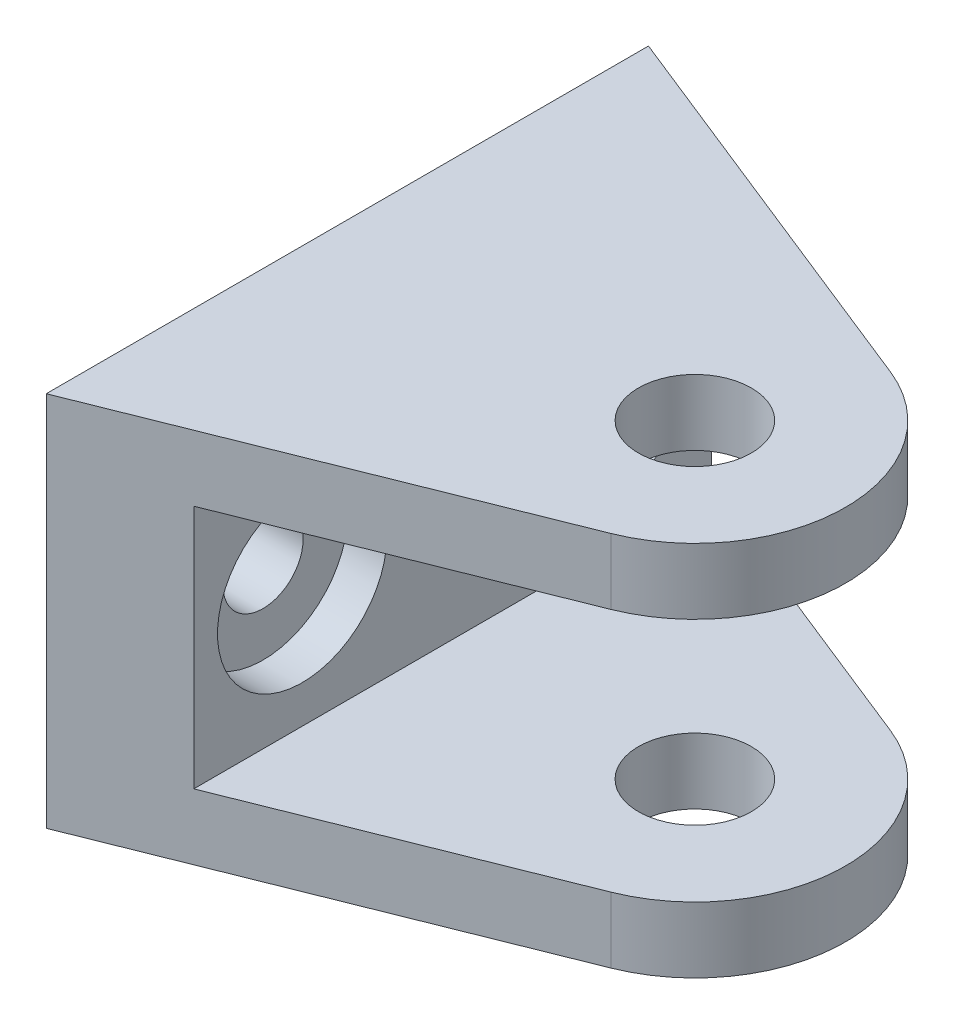
ISO-10303-21;
HEADER;
FILE_DESCRIPTION(('STEP AP214'),'2;1');
FILE_NAME('part.step','',(''),(''),'','','');
FILE_SCHEMA(('AUTOMOTIVE_DESIGN { 1 0 10303 214 1 1 1 1 }'));
ENDSEC;
DATA;
#1=APPLICATION_CONTEXT('core data for automotive mechanical design processes');
#2=APPLICATION_PROTOCOL_DEFINITION('international standard','automotive_design',2000,#1);
#3=PRODUCT_CONTEXT('',#1,'mechanical');
#4=PRODUCT('Part','Part','',(#3));
#5=PRODUCT_RELATED_PRODUCT_CATEGORY('part','',(#4));
#6=PRODUCT_DEFINITION_FORMATION('','',#4);
#7=PRODUCT_DEFINITION_CONTEXT('part definition',#1,'design');
#8=PRODUCT_DEFINITION('design','',#6,#7);
#9=PRODUCT_DEFINITION_SHAPE('','',#8);
#10=(LENGTH_UNIT() NAMED_UNIT(*) SI_UNIT(.MILLI.,.METRE.));
#11=(NAMED_UNIT(*) PLANE_ANGLE_UNIT() SI_UNIT($,.RADIAN.));
#12=(NAMED_UNIT(*) SI_UNIT($,.STERADIAN.) SOLID_ANGLE_UNIT());
#13=UNCERTAINTY_MEASURE_WITH_UNIT(LENGTH_MEASURE(1.E-05),#10,'distance_accuracy_value','');
#14=(GEOMETRIC_REPRESENTATION_CONTEXT(3) GLOBAL_UNCERTAINTY_ASSIGNED_CONTEXT((#13)) GLOBAL_UNIT_ASSIGNED_CONTEXT((#10,
#11,#12)) REPRESENTATION_CONTEXT('',''));
#15=CARTESIAN_POINT('',(0.,0.,0.));
#16=DIRECTION('',(0.,0.,1.));
#17=DIRECTION('',(1.,0.,0.));
#18=AXIS2_PLACEMENT_3D('',#15,#16,#17);
#19=CARTESIAN_POINT('',(0.,0.,50.8));
#20=DIRECTION('',(0.,1.,0.));
#21=DIRECTION('',(0.,0.,1.));
#22=AXIS2_PLACEMENT_3D('',#19,#20,#21);
#23=PLANE('',#22);
#24=CARTESIAN_POINT('',(29.3156655712476,0.,25.4));
#25=DIRECTION('',(0.,-1.,0.));
#26=DIRECTION('',(0.,0.,-1.));
#27=AXIS2_PLACEMENT_3D('',#24,#25,#26);
#28=CIRCLE('',#27,4.7625);
#29=CARTESIAN_POINT('',(29.3156655712476,0.,20.6375));
#30=VERTEX_POINT('',#29);
#31=EDGE_CURVE('E178',#30,#30,#28,.T.);
#32=ORIENTED_EDGE('',*,*,#31,.F.);
#33=EDGE_LOOP('',(#32));
#34=FACE_BOUND('',#33,.T.);
#35=DIRECTION('',(-0.928519820072014,0.,0.37128283522597));
#36=VECTOR('',#35,1.);
#37=CARTESIAN_POINT('',(0.,0.,50.8));
#38=LINE('',#37,#36);
#39=CARTESIAN_POINT('',(34.0309575786174,0.,37.1922017149146));
#40=VERTEX_POINT('',#39);
#41=CARTESIAN_POINT('',(0.,0.,50.8));
#42=VERTEX_POINT('',#41);
#43=EDGE_CURVE('E148',#40,#42,#38,.T.);
#44=ORIENTED_EDGE('',*,*,#43,.T.);
#45=DIRECTION('',(0.,0.,-1.));
#46=VECTOR('',#45,1.);
#47=CARTESIAN_POINT('',(0.,0.,50.8));
#48=LINE('',#47,#46);
#49=CARTESIAN_POINT('',(0.,0.,0.));
#50=VERTEX_POINT('',#49);
#51=EDGE_CURVE('E12',#42,#50,#48,.T.);
#52=ORIENTED_EDGE('',*,*,#51,.T.);
#53=DIRECTION('',(0.928519820072014,0.,0.37128283522597));
#54=VECTOR('',#53,1.);
#55=CARTESIAN_POINT('',(0.,0.,0.));
#56=LINE('',#55,#54);
#57=CARTESIAN_POINT('',(34.0309575786174,0.,13.6077982850854));
#58=VERTEX_POINT('',#57);
#59=EDGE_CURVE('E72',#50,#58,#56,.T.);
#60=ORIENTED_EDGE('',*,*,#59,.T.);
#61=CARTESIAN_POINT('',(29.3156655712476,0.,25.4));
#62=DIRECTION('',(0.,1.,0.));
#63=DIRECTION('',(0.,0.,1.));
#64=AXIS2_PLACEMENT_3D('',#61,#62,#63);
#65=CIRCLE('',#64,12.7);
#66=EDGE_CURVE('E159',#58,#40,#65,.F.);
#67=ORIENTED_EDGE('',*,*,#66,.T.);
#68=EDGE_LOOP('',(#44,#52,#60,#67));
#69=FACE_BOUND('',#68,.T.);
#70=ADVANCED_FACE('F48',(#34,#69),#23,.F.);
#71=CARTESIAN_POINT('',(42.0156655712476,5.5499,50.8));
#72=DIRECTION('',(0.,-1.,0.));
#73=DIRECTION('',(0.,0.,-1.));
#74=AXIS2_PLACEMENT_3D('',#71,#72,#73);
#75=PLANE('',#74);
#76=CARTESIAN_POINT('',(29.3156655712476,5.5499,25.4));
#77=DIRECTION('',(0.,-1.,0.));
#78=DIRECTION('',(0.,0.,-1.));
#79=AXIS2_PLACEMENT_3D('',#76,#77,#78);
#80=CIRCLE('',#79,4.7625);
#81=CARTESIAN_POINT('',(29.3156655712476,5.5499,20.6375));
#82=VERTEX_POINT('',#81);
#83=EDGE_CURVE('E190',#82,#82,#80,.T.);
#84=ORIENTED_EDGE('',*,*,#83,.T.);
#85=EDGE_LOOP('',(#84));
#86=FACE_BOUND('',#85,.T.);
#87=DIRECTION('',(-0.928519820072014,0.,0.37128283522597));
#88=VECTOR('',#87,1.);
#89=CARTESIAN_POINT('',(36.2237664206627,5.5499,36.3153735994738));
#90=LINE('',#89,#88);
#91=CARTESIAN_POINT('',(34.0309575786174,5.5499,37.1922017149146));
#92=VERTEX_POINT('',#91);
#93=CARTESIAN_POINT('',(8.89,5.5499,47.2451976858147));
#94=VERTEX_POINT('',#93);
#95=EDGE_CURVE('E170',#92,#94,#90,.T.);
#96=ORIENTED_EDGE('',*,*,#95,.F.);
#97=CARTESIAN_POINT('',(29.3156655712476,5.5499,25.4));
#98=DIRECTION('',(0.,-1.,0.));
#99=DIRECTION('',(0.,0.,-1.));
#100=AXIS2_PLACEMENT_3D('',#97,#98,#99);
#101=CIRCLE('',#100,12.7);
#102=CARTESIAN_POINT('',(34.0309575786174,5.5499,13.6077982850854));
#103=VERTEX_POINT('',#102);
#104=EDGE_CURVE('E175',#103,#92,#101,.T.);
#105=ORIENTED_EDGE('',*,*,#104,.F.);
#106=DIRECTION('',(0.928519820072014,0.,0.37128283522597));
#107=VECTOR('',#106,1.);
#108=CARTESIAN_POINT('',(53.7367347657428,5.5499,21.4874543421847));
#109=LINE('',#108,#107);
#110=CARTESIAN_POINT('',(8.89,5.5499,3.55480231418525));
#111=VERTEX_POINT('',#110);
#112=EDGE_CURVE('E162',#111,#103,#109,.T.);
#113=ORIENTED_EDGE('',*,*,#112,.F.);
#114=DIRECTION('',(0.,0.,-1.));
#115=VECTOR('',#114,1.);
#116=CARTESIAN_POINT('',(8.89,5.5499,50.8));
#117=LINE('',#116,#115);
#118=EDGE_CURVE('E57',#94,#111,#117,.T.);
#119=ORIENTED_EDGE('',*,*,#118,.F.);
#120=EDGE_LOOP('',(#96,#105,#113,#119));
#121=FACE_BOUND('',#120,.T.);
#122=ADVANCED_FACE('F249',(#86,#121),#75,.F.);
#123=CARTESIAN_POINT('',(8.89,5.5499,50.8));
#124=DIRECTION('',(-1.,0.,0.));
#125=DIRECTION('',(0.,-1.,0.));
#126=AXIS2_PLACEMENT_3D('',#123,#124,#125);
#127=PLANE('',#126);
#128=CARTESIAN_POINT('',(8.88999999999999,15.875,12.7));
#129=DIRECTION('',(1.,0.,0.));
#130=DIRECTION('',(0.,0.,-1.));
#131=AXIS2_PLACEMENT_3D('',#128,#129,#130);
#132=CIRCLE('',#131,7.14374999999999);
#133=CARTESIAN_POINT('',(8.88999999999999,15.875,5.55625));
#134=VERTEX_POINT('',#133);
#135=EDGE_CURVE('E194',#134,#134,#132,.T.);
#136=ORIENTED_EDGE('',*,*,#135,.F.);
#137=EDGE_LOOP('',(#136));
#138=FACE_BOUND('',#137,.T.);
#139=CARTESIAN_POINT('',(8.88999999999999,15.875,38.1));
#140=DIRECTION('',(1.,0.,0.));
#141=DIRECTION('',(0.,0.,-1.));
#142=AXIS2_PLACEMENT_3D('',#139,#140,#141);
#143=CIRCLE('',#142,7.14374999999999);
#144=CARTESIAN_POINT('',(8.88999999999999,15.875,30.95625));
#145=VERTEX_POINT('',#144);
#146=EDGE_CURVE('E210',#145,#145,#143,.T.);
#147=ORIENTED_EDGE('',*,*,#146,.F.);
#148=EDGE_LOOP('',(#147));
#149=FACE_BOUND('',#148,.T.);
#150=DIRECTION('',(0.,1.,0.));
#151=VECTOR('',#150,1.);
#152=CARTESIAN_POINT('',(8.89,5.5499,47.2451976858147));
#153=LINE('',#152,#151);
#154=CARTESIAN_POINT('',(8.89,26.2001,47.2451976858147));
#155=VERTEX_POINT('',#154);
#156=EDGE_CURVE('E167',#94,#155,#153,.T.);
#157=ORIENTED_EDGE('',*,*,#156,.F.);
#158=ORIENTED_EDGE('',*,*,#118,.T.);
#159=DIRECTION('',(0.,-1.,0.));
#160=VECTOR('',#159,1.);
#161=CARTESIAN_POINT('',(8.89,5.54990000000001,3.55480231418525));
#162=LINE('',#161,#160);
#163=CARTESIAN_POINT('',(8.89,26.2001,3.55480231418524));
#164=VERTEX_POINT('',#163);
#165=EDGE_CURVE('E158',#164,#111,#162,.T.);
#166=ORIENTED_EDGE('',*,*,#165,.F.);
#167=DIRECTION('',(0.,0.,-1.));
#168=VECTOR('',#167,1.);
#169=CARTESIAN_POINT('',(8.89,26.2001,50.8));
#170=LINE('',#169,#168);
#171=EDGE_CURVE('E235',#155,#164,#170,.T.);
#172=ORIENTED_EDGE('',*,*,#171,.F.);
#173=EDGE_LOOP('',(#157,#158,#166,#172));
#174=FACE_BOUND('',#173,.T.);
#175=ADVANCED_FACE('F244',(#138,#149,#174),#127,.F.);
#176=CARTESIAN_POINT('',(8.89,26.2001,50.8));
#177=DIRECTION('',(0.,1.,0.));
#178=DIRECTION('',(0.,0.,1.));
#179=AXIS2_PLACEMENT_3D('',#176,#177,#178);
#180=PLANE('',#179);
#181=CARTESIAN_POINT('',(29.3156655712476,26.2001,25.4));
#182=DIRECTION('',(0.,1.,0.));
#183=DIRECTION('',(0.,0.,1.));
#184=AXIS2_PLACEMENT_3D('',#181,#182,#183);
#185=CIRCLE('',#184,4.7625);
#186=CARTESIAN_POINT('',(29.3156655712476,26.2001,30.1625));
#187=VERTEX_POINT('',#186);
#188=EDGE_CURVE('E186',#187,#187,#185,.T.);
#189=ORIENTED_EDGE('',*,*,#188,.T.);
#190=EDGE_LOOP('',(#189));
#191=FACE_BOUND('',#190,.T.);
#192=DIRECTION('',(0.928519820072014,0.,-0.37128283522597));
#193=VECTOR('',#192,1.);
#194=CARTESIAN_POINT('',(7.66450511020976,26.2001,47.735230539611));
#195=LINE('',#194,#193);
#196=CARTESIAN_POINT('',(34.0309575786174,26.2001,37.1922017149146));
#197=VERTEX_POINT('',#196);
#198=EDGE_CURVE('E121',#155,#197,#195,.T.);
#199=ORIENTED_EDGE('',*,*,#198,.F.);
#200=ORIENTED_EDGE('',*,*,#171,.T.);
#201=DIRECTION('',(-0.928519820072014,0.,-0.37128283522597));
#202=VECTOR('',#201,1.);
#203=CARTESIAN_POINT('',(25.1774734552899,26.2001,10.0675974020475));
#204=LINE('',#203,#202);
#205=CARTESIAN_POINT('',(34.0309575786174,26.2001,13.6077982850854));
#206=VERTEX_POINT('',#205);
#207=EDGE_CURVE('E155',#206,#164,#204,.T.);
#208=ORIENTED_EDGE('',*,*,#207,.F.);
#209=CARTESIAN_POINT('',(29.3156655712476,26.2001,25.4));
#210=DIRECTION('',(0.,1.,0.));
#211=DIRECTION('',(0.,0.,1.));
#212=AXIS2_PLACEMENT_3D('',#209,#210,#211);
#213=CIRCLE('',#212,12.7);
#214=EDGE_CURVE('E64',#197,#206,#213,.T.);
#215=ORIENTED_EDGE('',*,*,#214,.F.);
#216=EDGE_LOOP('',(#199,#200,#208,#215));
#217=FACE_BOUND('',#216,.T.);
#218=ADVANCED_FACE('F264',(#191,#217),#180,.F.);
#219=CARTESIAN_POINT('',(42.0156655712476,31.75,50.8));
#220=DIRECTION('',(0.,-1.,0.));
#221=DIRECTION('',(0.,0.,-1.));
#222=AXIS2_PLACEMENT_3D('',#219,#220,#221);
#223=PLANE('',#222);
#224=CARTESIAN_POINT('',(29.3156655712476,31.75,25.4));
#225=DIRECTION('',(0.,-1.,0.));
#226=DIRECTION('',(0.,0.,-1.));
#227=AXIS2_PLACEMENT_3D('',#224,#225,#226);
#228=CIRCLE('',#227,4.7625);
#229=CARTESIAN_POINT('',(29.3156655712476,31.75,20.6375));
#230=VERTEX_POINT('',#229);
#231=EDGE_CURVE('E182',#230,#230,#228,.F.);
#232=ORIENTED_EDGE('',*,*,#231,.F.);
#233=EDGE_LOOP('',(#232));
#234=FACE_BOUND('',#233,.T.);
#235=DIRECTION('',(0.928519820072014,0.,-0.37128283522597));
#236=VECTOR('',#235,1.);
#237=CARTESIAN_POINT('',(0.,31.75,50.8));
#238=LINE('',#237,#236);
#239=CARTESIAN_POINT('',(0.,31.75,50.8));
#240=VERTEX_POINT('',#239);
#241=CARTESIAN_POINT('',(34.0309575786174,31.75,37.1922017149146));
#242=VERTEX_POINT('',#241);
#243=EDGE_CURVE('E118',#240,#242,#238,.T.);
#244=ORIENTED_EDGE('',*,*,#243,.T.);
#245=CARTESIAN_POINT('',(29.3156655712476,31.75,25.4));
#246=DIRECTION('',(0.,1.,0.));
#247=DIRECTION('',(0.,0.,1.));
#248=AXIS2_PLACEMENT_3D('',#245,#246,#247);
#249=CIRCLE('',#248,12.7);
#250=CARTESIAN_POINT('',(34.0309575786174,31.75,13.6077982850854));
#251=VERTEX_POINT('',#250);
#252=EDGE_CURVE('E126',#242,#251,#249,.T.);
#253=ORIENTED_EDGE('',*,*,#252,.T.);
#254=DIRECTION('',(-0.928519820072014,0.,-0.37128283522597));
#255=VECTOR('',#254,1.);
#256=CARTESIAN_POINT('',(0.,31.75,0.));
#257=LINE('',#256,#255);
#258=CARTESIAN_POINT('',(0.,31.75,0.));
#259=VERTEX_POINT('',#258);
#260=EDGE_CURVE('E124',#251,#259,#257,.T.);
#261=ORIENTED_EDGE('',*,*,#260,.T.);
#262=DIRECTION('',(0.,0.,-1.));
#263=VECTOR('',#262,1.);
#264=CARTESIAN_POINT('',(0.,31.75,50.8));
#265=LINE('',#264,#263);
#266=EDGE_CURVE('E136',#240,#259,#265,.T.);
#267=ORIENTED_EDGE('',*,*,#266,.F.);
#268=EDGE_LOOP('',(#244,#253,#261,#267));
#269=FACE_BOUND('',#268,.T.);
#270=ADVANCED_FACE('F134',(#234,#269),#223,.F.);
#271=CARTESIAN_POINT('',(0.,31.75,50.8));
#272=DIRECTION('',(1.,0.,0.));
#273=DIRECTION('',(0.,0.,-1.));
#274=AXIS2_PLACEMENT_3D('',#271,#272,#273);
#275=PLANE('',#274);
#276=CARTESIAN_POINT('',(0.,15.875,12.7));
#277=DIRECTION('',(1.,0.,0.));
#278=DIRECTION('',(0.,0.,-1.));
#279=AXIS2_PLACEMENT_3D('',#276,#277,#278);
#280=CIRCLE('',#279,3.37820000000001);
#281=CARTESIAN_POINT('',(0.,15.875,9.32179999999999));
#282=VERTEX_POINT('',#281);
#283=EDGE_CURVE('E206',#282,#282,#280,.T.);
#284=ORIENTED_EDGE('',*,*,#283,.T.);
#285=EDGE_LOOP('',(#284));
#286=FACE_BOUND('',#285,.T.);
#287=CARTESIAN_POINT('',(0.,15.875,38.1));
#288=DIRECTION('',(1.,0.,0.));
#289=DIRECTION('',(0.,0.,-1.));
#290=AXIS2_PLACEMENT_3D('',#287,#288,#289);
#291=CIRCLE('',#290,3.37820000000001);
#292=CARTESIAN_POINT('',(0.,15.875,34.7218));
#293=VERTEX_POINT('',#292);
#294=EDGE_CURVE('E222',#293,#293,#291,.T.);
#295=ORIENTED_EDGE('',*,*,#294,.T.);
#296=EDGE_LOOP('',(#295));
#297=FACE_BOUND('',#296,.T.);
#298=DIRECTION('',(0.,-1.,0.));
#299=VECTOR('',#298,1.);
#300=CARTESIAN_POINT('',(0.,31.75,0.));
#301=LINE('',#300,#299);
#302=EDGE_CURVE('E226',#259,#50,#301,.T.);
#303=ORIENTED_EDGE('',*,*,#302,.T.);
#304=ORIENTED_EDGE('',*,*,#51,.F.);
#305=DIRECTION('',(0.,-1.,0.));
#306=VECTOR('',#305,1.);
#307=CARTESIAN_POINT('',(0.,31.75,50.8));
#308=LINE('',#307,#306);
#309=EDGE_CURVE('E227',#240,#42,#308,.T.);
#310=ORIENTED_EDGE('',*,*,#309,.F.);
#311=ORIENTED_EDGE('',*,*,#266,.T.);
#312=EDGE_LOOP('',(#303,#304,#310,#311));
#313=FACE_BOUND('',#312,.T.);
#314=ADVANCED_FACE('F50',(#286,#297,#313),#275,.F.);
#315=CARTESIAN_POINT('',(8.88999999999999,15.875,38.1));
#316=DIRECTION('',(1.,0.,0.));
#317=DIRECTION('',(0.,0.,-1.));
#318=AXIS2_PLACEMENT_3D('',#315,#316,#317);
#319=CYLINDRICAL_SURFACE('',#318,3.3782);
#320=ORIENTED_EDGE('',*,*,#294,.F.);
#321=EDGE_LOOP('',(#320));
#322=FACE_BOUND('',#321,.T.);
#323=CARTESIAN_POINT('',(5.58799999999999,15.875,38.1));
#324=DIRECTION('',(1.,0.,0.));
#325=DIRECTION('',(0.,0.,-1.));
#326=AXIS2_PLACEMENT_3D('',#323,#324,#325);
#327=CIRCLE('',#326,3.3782);
#328=CARTESIAN_POINT('',(5.58799999999999,15.875,34.7218));
#329=VERTEX_POINT('',#328);
#330=EDGE_CURVE('E218',#329,#329,#327,.T.);
#331=ORIENTED_EDGE('',*,*,#330,.T.);
#332=EDGE_LOOP('',(#331));
#333=FACE_BOUND('',#332,.T.);
#334=ADVANCED_FACE('F318',(#322,#333),#319,.F.);
#335=CARTESIAN_POINT('',(5.58799999999999,19.2532,38.1));
#336=DIRECTION('',(-1.,0.,0.));
#337=DIRECTION('',(0.,0.,1.));
#338=AXIS2_PLACEMENT_3D('',#335,#336,#337);
#339=PLANE('',#338);
#340=ORIENTED_EDGE('',*,*,#330,.F.);
#341=EDGE_LOOP('',(#340));
#342=FACE_BOUND('',#341,.T.);
#343=CARTESIAN_POINT('',(5.58799999999999,15.875,38.1));
#344=DIRECTION('',(1.,0.,0.));
#345=DIRECTION('',(0.,0.,-1.));
#346=AXIS2_PLACEMENT_3D('',#343,#344,#345);
#347=CIRCLE('',#346,7.14375);
#348=CARTESIAN_POINT('',(5.58799999999999,15.875,30.95625));
#349=VERTEX_POINT('',#348);
#350=EDGE_CURVE('E214',#349,#349,#347,.T.);
#351=ORIENTED_EDGE('',*,*,#350,.T.);
#352=EDGE_LOOP('',(#351));
#353=FACE_BOUND('',#352,.T.);
#354=ADVANCED_FACE('F314',(#342,#353),#339,.F.);
#355=CARTESIAN_POINT('',(8.88999999999999,15.875,38.1));
#356=DIRECTION('',(1.,0.,0.));
#357=DIRECTION('',(0.,0.,-1.));
#358=AXIS2_PLACEMENT_3D('',#355,#356,#357);
#359=CYLINDRICAL_SURFACE('',#358,7.14375);
#360=ORIENTED_EDGE('',*,*,#350,.F.);
#361=EDGE_LOOP('',(#360));
#362=FACE_BOUND('',#361,.T.);
#363=ORIENTED_EDGE('',*,*,#146,.T.);
#364=EDGE_LOOP('',(#363));
#365=FACE_BOUND('',#364,.T.);
#366=ADVANCED_FACE('F310',(#362,#365),#359,.F.);
#367=CARTESIAN_POINT('',(8.88999999999999,15.875,12.7));
#368=DIRECTION('',(1.,0.,0.));
#369=DIRECTION('',(0.,0.,-1.));
#370=AXIS2_PLACEMENT_3D('',#367,#368,#369);
#371=CYLINDRICAL_SURFACE('',#370,3.3782);
#372=ORIENTED_EDGE('',*,*,#283,.F.);
#373=EDGE_LOOP('',(#372));
#374=FACE_BOUND('',#373,.T.);
#375=CARTESIAN_POINT('',(5.58799999999999,15.875,12.7));
#376=DIRECTION('',(1.,0.,0.));
#377=DIRECTION('',(0.,0.,-1.));
#378=AXIS2_PLACEMENT_3D('',#375,#376,#377);
#379=CIRCLE('',#378,3.3782);
#380=CARTESIAN_POINT('',(5.58799999999999,15.875,9.32179999999999));
#381=VERTEX_POINT('',#380);
#382=EDGE_CURVE('E202',#381,#381,#379,.T.);
#383=ORIENTED_EDGE('',*,*,#382,.T.);
#384=EDGE_LOOP('',(#383));
#385=FACE_BOUND('',#384,.T.);
#386=ADVANCED_FACE('F306',(#374,#385),#371,.F.);
#387=CARTESIAN_POINT('',(5.58799999999999,19.2532,12.7));
#388=DIRECTION('',(-1.,0.,0.));
#389=DIRECTION('',(0.,0.,1.));
#390=AXIS2_PLACEMENT_3D('',#387,#388,#389);
#391=PLANE('',#390);
#392=ORIENTED_EDGE('',*,*,#382,.F.);
#393=EDGE_LOOP('',(#392));
#394=FACE_BOUND('',#393,.T.);
#395=CARTESIAN_POINT('',(5.58799999999999,15.875,12.7));
#396=DIRECTION('',(1.,0.,0.));
#397=DIRECTION('',(0.,0.,-1.));
#398=AXIS2_PLACEMENT_3D('',#395,#396,#397);
#399=CIRCLE('',#398,7.14375);
#400=CARTESIAN_POINT('',(5.58799999999999,15.875,5.55625));
#401=VERTEX_POINT('',#400);
#402=EDGE_CURVE('E198',#401,#401,#399,.T.);
#403=ORIENTED_EDGE('',*,*,#402,.T.);
#404=EDGE_LOOP('',(#403));
#405=FACE_BOUND('',#404,.T.);
#406=ADVANCED_FACE('F302',(#394,#405),#391,.F.);
#407=CARTESIAN_POINT('',(8.88999999999999,15.875,12.7));
#408=DIRECTION('',(1.,0.,0.));
#409=DIRECTION('',(0.,0.,-1.));
#410=AXIS2_PLACEMENT_3D('',#407,#408,#409);
#411=CYLINDRICAL_SURFACE('',#410,7.14375);
#412=ORIENTED_EDGE('',*,*,#402,.F.);
#413=EDGE_LOOP('',(#412));
#414=FACE_BOUND('',#413,.T.);
#415=ORIENTED_EDGE('',*,*,#135,.T.);
#416=EDGE_LOOP('',(#415));
#417=FACE_BOUND('',#416,.T.);
#418=ADVANCED_FACE('F296',(#414,#417),#411,.F.);
#419=CARTESIAN_POINT('',(29.3156655712476,45.2203841816037,25.4));
#420=DIRECTION('',(0.,-1.,0.));
#421=DIRECTION('',(0.,0.,-1.));
#422=AXIS2_PLACEMENT_3D('',#419,#420,#421);
#423=CYLINDRICAL_SURFACE('',#422,4.7625);
#424=ORIENTED_EDGE('',*,*,#231,.T.);
#425=EDGE_LOOP('',(#424));
#426=FACE_BOUND('',#425,.T.);
#427=ORIENTED_EDGE('',*,*,#188,.F.);
#428=EDGE_LOOP('',(#427));
#429=FACE_BOUND('',#428,.T.);
#430=ADVANCED_FACE('F288',(#426,#429),#423,.F.);
#431=ORIENTED_EDGE('',*,*,#31,.T.);
#432=EDGE_LOOP('',(#431));
#433=FACE_BOUND('',#432,.T.);
#434=ORIENTED_EDGE('',*,*,#83,.F.);
#435=EDGE_LOOP('',(#434));
#436=FACE_BOUND('',#435,.T.);
#437=ADVANCED_FACE('F286',(#433,#436),#423,.F.);
#438=CARTESIAN_POINT('',(29.3156655712476,-66.5831050047845,25.4));
#439=DIRECTION('',(0.,1.,0.));
#440=DIRECTION('',(0.,0.,1.));
#441=AXIS2_PLACEMENT_3D('',#438,#439,#440);
#442=CYLINDRICAL_SURFACE('',#441,12.7);
#443=ORIENTED_EDGE('',*,*,#66,.F.);
#444=DIRECTION('',(0.,1.,0.));
#445=VECTOR('',#444,1.);
#446=CARTESIAN_POINT('',(34.0309575786174,-66.5831050047845,13.6077982850854));
#447=LINE('',#446,#445);
#448=EDGE_CURVE('E145',#58,#103,#447,.T.);
#449=ORIENTED_EDGE('',*,*,#448,.T.);
#450=ORIENTED_EDGE('',*,*,#104,.T.);
#451=DIRECTION('',(0.,1.,0.));
#452=VECTOR('',#451,1.);
#453=CARTESIAN_POINT('',(34.0309575786174,-66.5831050047845,37.1922017149146));
#454=LINE('',#453,#452);
#455=EDGE_CURVE('E123',#40,#92,#454,.T.);
#456=ORIENTED_EDGE('',*,*,#455,.F.);
#457=EDGE_LOOP('',(#443,#449,#450,#456));
#458=FACE_BOUND('',#457,.T.);
#459=ADVANCED_FACE('F253',(#458),#442,.T.);
#460=ORIENTED_EDGE('',*,*,#214,.T.);
#461=EDGE_CURVE('E128',#206,#251,#447,.T.);
#462=ORIENTED_EDGE('',*,*,#461,.T.);
#463=ORIENTED_EDGE('',*,*,#252,.F.);
#464=EDGE_CURVE('E114',#197,#242,#454,.T.);
#465=ORIENTED_EDGE('',*,*,#464,.F.);
#466=EDGE_LOOP('',(#460,#462,#463,#465));
#467=FACE_BOUND('',#466,.T.);
#468=ADVANCED_FACE('F127',(#467),#442,.T.);
#469=CARTESIAN_POINT('',(0.,-66.5831050047845,50.8));
#470=DIRECTION('',(0.37128283522597,0.,0.928519820072014));
#471=DIRECTION('',(0.928519820072014,0.,-0.37128283522597));
#472=AXIS2_PLACEMENT_3D('',#469,#470,#471);
#473=PLANE('',#472);
#474=ORIENTED_EDGE('',*,*,#95,.T.);
#475=ORIENTED_EDGE('',*,*,#156,.T.);
#476=ORIENTED_EDGE('',*,*,#198,.T.);
#477=ORIENTED_EDGE('',*,*,#464,.T.);
#478=ORIENTED_EDGE('',*,*,#243,.F.);
#479=ORIENTED_EDGE('',*,*,#309,.T.);
#480=ORIENTED_EDGE('',*,*,#43,.F.);
#481=ORIENTED_EDGE('',*,*,#455,.T.);
#482=EDGE_LOOP('',(#474,#475,#476,#477,#478,#479,#480,#481));
#483=FACE_BOUND('',#482,.T.);
#484=ADVANCED_FACE('F116',(#483),#473,.T.);
#485=CARTESIAN_POINT('',(0.,-66.5831050047845,0.));
#486=DIRECTION('',(0.37128283522597,0.,-0.928519820072014));
#487=DIRECTION('',(-0.928519820072014,0.,-0.37128283522597));
#488=AXIS2_PLACEMENT_3D('',#485,#486,#487);
#489=PLANE('',#488);
#490=ORIENTED_EDGE('',*,*,#112,.T.);
#491=ORIENTED_EDGE('',*,*,#448,.F.);
#492=ORIENTED_EDGE('',*,*,#59,.F.);
#493=ORIENTED_EDGE('',*,*,#302,.F.);
#494=ORIENTED_EDGE('',*,*,#260,.F.);
#495=ORIENTED_EDGE('',*,*,#461,.F.);
#496=ORIENTED_EDGE('',*,*,#207,.T.);
#497=ORIENTED_EDGE('',*,*,#165,.T.);
#498=EDGE_LOOP('',(#490,#491,#492,#493,#494,#495,#496,#497));
#499=FACE_BOUND('',#498,.T.);
#500=ADVANCED_FACE('F251',(#499),#489,.T.);
#501=CLOSED_SHELL('',(#70,#122,#175,#218,#270,#314,#334,#354,#366,#386,#406,#418,#430,#437,#459,
#468,#484,#500));
#502=MANIFOLD_SOLID_BREP('B2',#501);
#503=ADVANCED_BREP_SHAPE_REPRESENTATION('',(#18,#502),#14);
#504=SHAPE_DEFINITION_REPRESENTATION(#9,#503);
ENDSEC;
END-ISO-10303-21;
